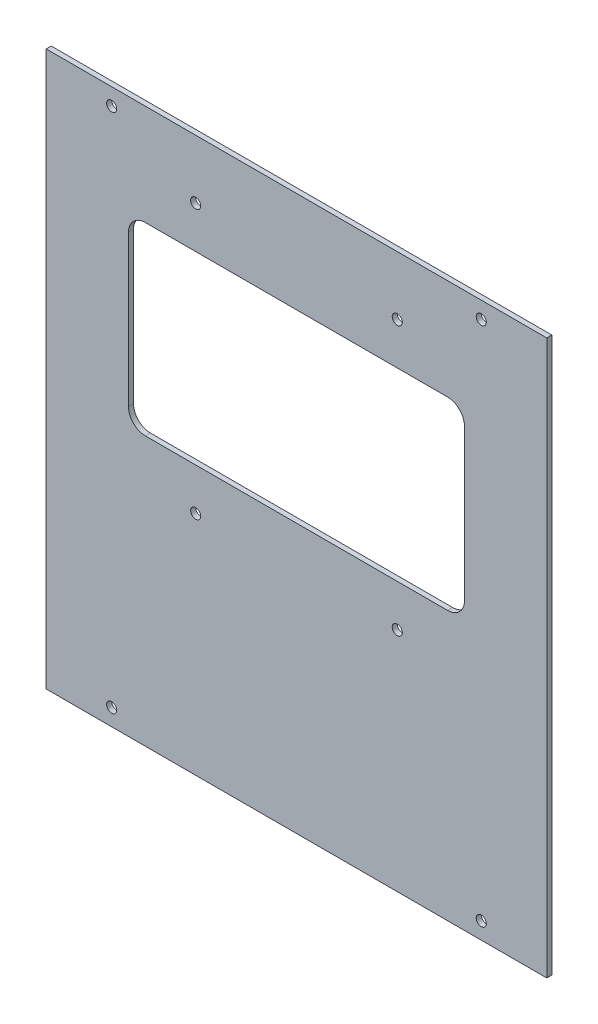
ISO-10303-21;
HEADER;
FILE_DESCRIPTION(('STEP AP214'),'2;1');
FILE_NAME('part.step','',(''),(''),'','','');
FILE_SCHEMA(('AUTOMOTIVE_DESIGN { 1 0 10303 214 1 1 1 1 }'));
ENDSEC;
DATA;
#1=APPLICATION_CONTEXT('core data for automotive mechanical design processes');
#2=APPLICATION_PROTOCOL_DEFINITION('international standard','automotive_design',2000,#1);
#3=PRODUCT_CONTEXT('',#1,'mechanical');
#4=PRODUCT('Part','Part','',(#3));
#5=PRODUCT_RELATED_PRODUCT_CATEGORY('part','',(#4));
#6=PRODUCT_DEFINITION_FORMATION('','',#4);
#7=PRODUCT_DEFINITION_CONTEXT('part definition',#1,'design');
#8=PRODUCT_DEFINITION('design','',#6,#7);
#9=PRODUCT_DEFINITION_SHAPE('','',#8);
#10=(LENGTH_UNIT() NAMED_UNIT(*) SI_UNIT(.MILLI.,.METRE.));
#11=(NAMED_UNIT(*) PLANE_ANGLE_UNIT() SI_UNIT($,.RADIAN.));
#12=(NAMED_UNIT(*) SI_UNIT($,.STERADIAN.) SOLID_ANGLE_UNIT());
#13=UNCERTAINTY_MEASURE_WITH_UNIT(LENGTH_MEASURE(1.E-05),#10,'distance_accuracy_value','');
#14=(GEOMETRIC_REPRESENTATION_CONTEXT(3) GLOBAL_UNCERTAINTY_ASSIGNED_CONTEXT((#13)) GLOBAL_UNIT_ASSIGNED_CONTEXT((#10,
#11,#12)) REPRESENTATION_CONTEXT('',''));
#15=CARTESIAN_POINT('',(0.,0.,0.));
#16=DIRECTION('',(0.,0.,1.));
#17=DIRECTION('',(1.,0.,0.));
#18=AXIS2_PLACEMENT_3D('',#15,#16,#17);
#19=CARTESIAN_POINT('',(0.,0.,1.5));
#20=DIRECTION('',(0.,0.,1.));
#21=DIRECTION('',(1.,0.,0.));
#22=AXIS2_PLACEMENT_3D('',#19,#20,#21);
#23=PLANE('',#22);
#24=CARTESIAN_POINT('',(55.,160.,1.5));
#25=DIRECTION('',(0.,0.,1.));
#26=DIRECTION('',(-1.,0.,0.));
#27=AXIS2_PLACEMENT_3D('',#24,#25,#26);
#28=CIRCLE('',#27,1.5);
#29=CARTESIAN_POINT('',(53.5,160.,1.5));
#30=VERTEX_POINT('',#29);
#31=EDGE_CURVE('E310',#30,#30,#28,.T.);
#32=ORIENTED_EDGE('',*,*,#31,.F.);
#33=EDGE_LOOP('',(#32));
#34=FACE_BOUND('',#33,.T.);
#35=CARTESIAN_POINT('',(55.,4.99999999999999,1.5));
#36=DIRECTION('',(0.,0.,1.));
#37=DIRECTION('',(1.,0.,0.));
#38=AXIS2_PLACEMENT_3D('',#35,#36,#37);
#39=CIRCLE('',#38,1.5);
#40=CARTESIAN_POINT('',(56.5,4.99999999999999,1.5));
#41=VERTEX_POINT('',#40);
#42=EDGE_CURVE('E312',#41,#41,#39,.T.);
#43=ORIENTED_EDGE('',*,*,#42,.F.);
#44=EDGE_LOOP('',(#43));
#45=FACE_BOUND('',#44,.T.);
#46=CARTESIAN_POINT('',(-55.,4.99999999999999,1.5));
#47=DIRECTION('',(0.,0.,1.));
#48=DIRECTION('',(-1.,0.,0.));
#49=AXIS2_PLACEMENT_3D('',#46,#47,#48);
#50=CIRCLE('',#49,1.5);
#51=CARTESIAN_POINT('',(-56.5,4.99999999999999,1.5));
#52=VERTEX_POINT('',#51);
#53=EDGE_CURVE('E318',#52,#52,#50,.T.);
#54=ORIENTED_EDGE('',*,*,#53,.F.);
#55=EDGE_LOOP('',(#54));
#56=FACE_BOUND('',#55,.T.);
#57=CARTESIAN_POINT('',(-55.,160.,1.5));
#58=DIRECTION('',(0.,0.,1.));
#59=DIRECTION('',(1.,0.,0.));
#60=AXIS2_PLACEMENT_3D('',#57,#58,#59);
#61=CIRCLE('',#60,1.5);
#62=CARTESIAN_POINT('',(-53.5,160.,1.5));
#63=VERTEX_POINT('',#62);
#64=EDGE_CURVE('E324',#63,#63,#61,.T.);
#65=ORIENTED_EDGE('',*,*,#64,.F.);
#66=EDGE_LOOP('',(#65));
#67=FACE_BOUND('',#66,.T.);
#68=CARTESIAN_POINT('',(30.,147.5,1.5));
#69=DIRECTION('',(0.,0.,1.));
#70=DIRECTION('',(-1.,0.,0.));
#71=AXIS2_PLACEMENT_3D('',#68,#69,#70);
#72=CIRCLE('',#71,1.50000000000001);
#73=CARTESIAN_POINT('',(28.5,147.5,1.5));
#74=VERTEX_POINT('',#73);
#75=EDGE_CURVE('E330',#74,#74,#72,.T.);
#76=ORIENTED_EDGE('',*,*,#75,.F.);
#77=EDGE_LOOP('',(#76));
#78=FACE_BOUND('',#77,.T.);
#79=CARTESIAN_POINT('',(30.,67.5,1.5));
#80=DIRECTION('',(0.,0.,1.));
#81=DIRECTION('',(1.,0.,0.));
#82=AXIS2_PLACEMENT_3D('',#79,#80,#81);
#83=CIRCLE('',#82,1.50000000000001);
#84=CARTESIAN_POINT('',(31.5,67.5,1.5));
#85=VERTEX_POINT('',#84);
#86=EDGE_CURVE('E336',#85,#85,#83,.T.);
#87=ORIENTED_EDGE('',*,*,#86,.F.);
#88=EDGE_LOOP('',(#87));
#89=FACE_BOUND('',#88,.T.);
#90=CARTESIAN_POINT('',(-30.,67.5,1.5));
#91=DIRECTION('',(0.,0.,1.));
#92=DIRECTION('',(-1.,0.,0.));
#93=AXIS2_PLACEMENT_3D('',#90,#91,#92);
#94=CIRCLE('',#93,1.5);
#95=CARTESIAN_POINT('',(-31.5,67.5,1.5));
#96=VERTEX_POINT('',#95);
#97=EDGE_CURVE('E342',#96,#96,#94,.T.);
#98=ORIENTED_EDGE('',*,*,#97,.F.);
#99=EDGE_LOOP('',(#98));
#100=FACE_BOUND('',#99,.T.);
#101=CARTESIAN_POINT('',(-30.,147.5,1.5));
#102=DIRECTION('',(0.,0.,1.));
#103=DIRECTION('',(1.,0.,0.));
#104=AXIS2_PLACEMENT_3D('',#101,#102,#103);
#105=CIRCLE('',#104,1.5);
#106=CARTESIAN_POINT('',(-28.5,147.5,1.5));
#107=VERTEX_POINT('',#106);
#108=EDGE_CURVE('E210',#107,#107,#105,.T.);
#109=ORIENTED_EDGE('',*,*,#108,.F.);
#110=EDGE_LOOP('',(#109));
#111=FACE_BOUND('',#110,.T.);
#112=DIRECTION('',(0.,-1.,0.));
#113=VECTOR('',#112,1.);
#114=CARTESIAN_POINT('',(-74.5,165.,1.5));
#115=LINE('',#114,#113);
#116=CARTESIAN_POINT('',(-74.5,165.,1.5));
#117=VERTEX_POINT('',#116);
#118=CARTESIAN_POINT('',(-74.5,0.,1.5));
#119=VERTEX_POINT('',#118);
#120=EDGE_CURVE('E135',#117,#119,#115,.T.);
#121=ORIENTED_EDGE('',*,*,#120,.T.);
#122=DIRECTION('',(1.,0.,0.));
#123=VECTOR('',#122,1.);
#124=CARTESIAN_POINT('',(-74.5,0.,1.5));
#125=LINE('',#124,#123);
#126=CARTESIAN_POINT('',(74.5,0.,1.5));
#127=VERTEX_POINT('',#126);
#128=EDGE_CURVE('E124',#119,#127,#125,.T.);
#129=ORIENTED_EDGE('',*,*,#128,.T.);
#130=DIRECTION('',(0.,1.,0.));
#131=VECTOR('',#130,1.);
#132=CARTESIAN_POINT('',(74.5,165.,1.5));
#133=LINE('',#132,#131);
#134=CARTESIAN_POINT('',(74.5,165.,1.5));
#135=VERTEX_POINT('',#134);
#136=EDGE_CURVE('E134',#127,#135,#133,.T.);
#137=ORIENTED_EDGE('',*,*,#136,.T.);
#138=DIRECTION('',(-1.,0.,0.));
#139=VECTOR('',#138,1.);
#140=CARTESIAN_POINT('',(-74.5,165.,1.5));
#141=LINE('',#140,#139);
#142=EDGE_CURVE('E139',#135,#117,#141,.T.);
#143=ORIENTED_EDGE('',*,*,#142,.T.);
#144=EDGE_LOOP('',(#121,#129,#137,#143));
#145=FACE_BOUND('',#144,.T.);
#146=DIRECTION('',(1.,0.,0.));
#147=VECTOR('',#146,1.);
#148=CARTESIAN_POINT('',(-50.0000000000001,80.,1.5));
#149=LINE('',#148,#147);
#150=CARTESIAN_POINT('',(-45.0000000000001,80.,1.5));
#151=VERTEX_POINT('',#150);
#152=CARTESIAN_POINT('',(45.,80.,1.5));
#153=VERTEX_POINT('',#152);
#154=EDGE_CURVE('E203',#151,#153,#149,.T.);
#155=ORIENTED_EDGE('',*,*,#154,.F.);
#156=CARTESIAN_POINT('',(-45.0000000000001,85.,1.5));
#157=DIRECTION('',(0.,0.,1.));
#158=DIRECTION('',(1.,0.,0.));
#159=AXIS2_PLACEMENT_3D('',#156,#157,#158);
#160=CIRCLE('',#159,5.);
#161=CARTESIAN_POINT('',(-50.0000000000001,85.,1.5));
#162=VERTEX_POINT('',#161);
#163=EDGE_CURVE('E11',#151,#162,#160,.F.);
#164=ORIENTED_EDGE('',*,*,#163,.T.);
#165=DIRECTION('',(0.,-1.,0.));
#166=VECTOR('',#165,1.);
#167=CARTESIAN_POINT('',(-50.,135.,1.5));
#168=LINE('',#167,#166);
#169=CARTESIAN_POINT('',(-50.,130.,1.5));
#170=VERTEX_POINT('',#169);
#171=EDGE_CURVE('E201',#170,#162,#168,.T.);
#172=ORIENTED_EDGE('',*,*,#171,.F.);
#173=CARTESIAN_POINT('',(-45.,130.,1.5));
#174=DIRECTION('',(0.,0.,1.));
#175=DIRECTION('',(1.,0.,0.));
#176=AXIS2_PLACEMENT_3D('',#173,#174,#175);
#177=CIRCLE('',#176,5.);
#178=CARTESIAN_POINT('',(-45.,135.,1.5));
#179=VERTEX_POINT('',#178);
#180=EDGE_CURVE('E182',#170,#179,#177,.F.);
#181=ORIENTED_EDGE('',*,*,#180,.T.);
#182=DIRECTION('',(-1.,0.,0.));
#183=VECTOR('',#182,1.);
#184=CARTESIAN_POINT('',(-50.,135.,1.5));
#185=LINE('',#184,#183);
#186=CARTESIAN_POINT('',(45.,135.,1.5));
#187=VERTEX_POINT('',#186);
#188=EDGE_CURVE('E215',#187,#179,#185,.T.);
#189=ORIENTED_EDGE('',*,*,#188,.F.);
#190=CARTESIAN_POINT('',(45.,130.,1.5));
#191=DIRECTION('',(0.,0.,1.));
#192=DIRECTION('',(1.,0.,0.));
#193=AXIS2_PLACEMENT_3D('',#190,#191,#192);
#194=CIRCLE('',#193,5.);
#195=CARTESIAN_POINT('',(50.,130.,1.5));
#196=VERTEX_POINT('',#195);
#197=EDGE_CURVE('E178',#187,#196,#194,.F.);
#198=ORIENTED_EDGE('',*,*,#197,.T.);
#199=DIRECTION('',(0.,1.,0.));
#200=VECTOR('',#199,1.);
#201=CARTESIAN_POINT('',(50.,135.,1.5));
#202=LINE('',#201,#200);
#203=CARTESIAN_POINT('',(50.,85.,1.5));
#204=VERTEX_POINT('',#203);
#205=EDGE_CURVE('E206',#204,#196,#202,.T.);
#206=ORIENTED_EDGE('',*,*,#205,.F.);
#207=CARTESIAN_POINT('',(45.,85.,1.5));
#208=DIRECTION('',(0.,0.,1.));
#209=DIRECTION('',(1.,0.,0.));
#210=AXIS2_PLACEMENT_3D('',#207,#208,#209);
#211=CIRCLE('',#210,5.);
#212=EDGE_CURVE('E174',#204,#153,#211,.F.);
#213=ORIENTED_EDGE('',*,*,#212,.T.);
#214=EDGE_LOOP('',(#155,#164,#172,#181,#189,#198,#206,#213));
#215=FACE_BOUND('',#214,.T.);
#216=ADVANCED_FACE('F35',(#34,#45,#56,#67,#78,#89,#100,#111,#145,#215),#23,.T.);
#217=CARTESIAN_POINT('',(0.,0.,0.));
#218=DIRECTION('',(0.,0.,1.));
#219=DIRECTION('',(1.,0.,0.));
#220=AXIS2_PLACEMENT_3D('',#217,#218,#219);
#221=PLANE('',#220);
#222=CARTESIAN_POINT('',(55.,160.,0.));
#223=DIRECTION('',(0.,0.,1.));
#224=DIRECTION('',(-1.,0.,0.));
#225=AXIS2_PLACEMENT_3D('',#222,#223,#224);
#226=CIRCLE('',#225,1.5);
#227=CARTESIAN_POINT('',(53.5,160.,0.));
#228=VERTEX_POINT('',#227);
#229=EDGE_CURVE('E308',#228,#228,#226,.T.);
#230=ORIENTED_EDGE('',*,*,#229,.T.);
#231=EDGE_LOOP('',(#230));
#232=FACE_BOUND('',#231,.T.);
#233=CARTESIAN_POINT('',(55.,4.99999999999999,0.));
#234=DIRECTION('',(0.,0.,1.));
#235=DIRECTION('',(1.,0.,0.));
#236=AXIS2_PLACEMENT_3D('',#233,#234,#235);
#237=CIRCLE('',#236,1.5);
#238=CARTESIAN_POINT('',(56.5,4.99999999999999,0.));
#239=VERTEX_POINT('',#238);
#240=EDGE_CURVE('E315',#239,#239,#237,.T.);
#241=ORIENTED_EDGE('',*,*,#240,.T.);
#242=EDGE_LOOP('',(#241));
#243=FACE_BOUND('',#242,.T.);
#244=CARTESIAN_POINT('',(-55.,4.99999999999999,0.));
#245=DIRECTION('',(0.,0.,1.));
#246=DIRECTION('',(-1.,0.,0.));
#247=AXIS2_PLACEMENT_3D('',#244,#245,#246);
#248=CIRCLE('',#247,1.5);
#249=CARTESIAN_POINT('',(-56.5,4.99999999999999,0.));
#250=VERTEX_POINT('',#249);
#251=EDGE_CURVE('E321',#250,#250,#248,.T.);
#252=ORIENTED_EDGE('',*,*,#251,.T.);
#253=EDGE_LOOP('',(#252));
#254=FACE_BOUND('',#253,.T.);
#255=CARTESIAN_POINT('',(-55.,160.,0.));
#256=DIRECTION('',(0.,0.,1.));
#257=DIRECTION('',(1.,0.,0.));
#258=AXIS2_PLACEMENT_3D('',#255,#256,#257);
#259=CIRCLE('',#258,1.5);
#260=CARTESIAN_POINT('',(-53.5,160.,0.));
#261=VERTEX_POINT('',#260);
#262=EDGE_CURVE('E327',#261,#261,#259,.T.);
#263=ORIENTED_EDGE('',*,*,#262,.T.);
#264=EDGE_LOOP('',(#263));
#265=FACE_BOUND('',#264,.T.);
#266=CARTESIAN_POINT('',(30.,147.5,0.));
#267=DIRECTION('',(0.,0.,1.));
#268=DIRECTION('',(-1.,0.,0.));
#269=AXIS2_PLACEMENT_3D('',#266,#267,#268);
#270=CIRCLE('',#269,1.50000000000001);
#271=CARTESIAN_POINT('',(28.5,147.5,0.));
#272=VERTEX_POINT('',#271);
#273=EDGE_CURVE('E333',#272,#272,#270,.T.);
#274=ORIENTED_EDGE('',*,*,#273,.T.);
#275=EDGE_LOOP('',(#274));
#276=FACE_BOUND('',#275,.T.);
#277=CARTESIAN_POINT('',(30.,67.5,0.));
#278=DIRECTION('',(0.,0.,1.));
#279=DIRECTION('',(1.,0.,0.));
#280=AXIS2_PLACEMENT_3D('',#277,#278,#279);
#281=CIRCLE('',#280,1.50000000000001);
#282=CARTESIAN_POINT('',(31.5,67.5,0.));
#283=VERTEX_POINT('',#282);
#284=EDGE_CURVE('E339',#283,#283,#281,.T.);
#285=ORIENTED_EDGE('',*,*,#284,.T.);
#286=EDGE_LOOP('',(#285));
#287=FACE_BOUND('',#286,.T.);
#288=CARTESIAN_POINT('',(-30.,67.5,0.));
#289=DIRECTION('',(0.,0.,1.));
#290=DIRECTION('',(-1.,0.,0.));
#291=AXIS2_PLACEMENT_3D('',#288,#289,#290);
#292=CIRCLE('',#291,1.5);
#293=CARTESIAN_POINT('',(-31.5,67.5,0.));
#294=VERTEX_POINT('',#293);
#295=EDGE_CURVE('E345',#294,#294,#292,.T.);
#296=ORIENTED_EDGE('',*,*,#295,.T.);
#297=EDGE_LOOP('',(#296));
#298=FACE_BOUND('',#297,.T.);
#299=CARTESIAN_POINT('',(-30.,147.5,0.));
#300=DIRECTION('',(0.,0.,1.));
#301=DIRECTION('',(1.,0.,0.));
#302=AXIS2_PLACEMENT_3D('',#299,#300,#301);
#303=CIRCLE('',#302,1.5);
#304=CARTESIAN_POINT('',(-28.5,147.5,0.));
#305=VERTEX_POINT('',#304);
#306=EDGE_CURVE('E218',#305,#305,#303,.T.);
#307=ORIENTED_EDGE('',*,*,#306,.T.);
#308=EDGE_LOOP('',(#307));
#309=FACE_BOUND('',#308,.T.);
#310=DIRECTION('',(0.,-1.,0.));
#311=VECTOR('',#310,1.);
#312=CARTESIAN_POINT('',(-74.5,165.,0.));
#313=LINE('',#312,#311);
#314=CARTESIAN_POINT('',(-74.5,165.,0.));
#315=VERTEX_POINT('',#314);
#316=CARTESIAN_POINT('',(-74.5,0.,0.));
#317=VERTEX_POINT('',#316);
#318=EDGE_CURVE('E147',#315,#317,#313,.T.);
#319=ORIENTED_EDGE('',*,*,#318,.F.);
#320=DIRECTION('',(-1.,0.,0.));
#321=VECTOR('',#320,1.);
#322=CARTESIAN_POINT('',(-74.5,165.,0.));
#323=LINE('',#322,#321);
#324=CARTESIAN_POINT('',(74.5,165.,0.));
#325=VERTEX_POINT('',#324);
#326=EDGE_CURVE('E143',#325,#315,#323,.T.);
#327=ORIENTED_EDGE('',*,*,#326,.F.);
#328=DIRECTION('',(0.,1.,0.));
#329=VECTOR('',#328,1.);
#330=CARTESIAN_POINT('',(74.5,165.,0.));
#331=LINE('',#330,#329);
#332=CARTESIAN_POINT('',(74.5,0.,0.));
#333=VERTEX_POINT('',#332);
#334=EDGE_CURVE('E228',#333,#325,#331,.T.);
#335=ORIENTED_EDGE('',*,*,#334,.F.);
#336=DIRECTION('',(1.,0.,0.));
#337=VECTOR('',#336,1.);
#338=CARTESIAN_POINT('',(-74.5,0.,0.));
#339=LINE('',#338,#337);
#340=EDGE_CURVE('E226',#317,#333,#339,.T.);
#341=ORIENTED_EDGE('',*,*,#340,.F.);
#342=EDGE_LOOP('',(#319,#327,#335,#341));
#343=FACE_BOUND('',#342,.T.);
#344=DIRECTION('',(-1.,0.,0.));
#345=VECTOR('',#344,1.);
#346=CARTESIAN_POINT('',(-50.,135.,0.));
#347=LINE('',#346,#345);
#348=CARTESIAN_POINT('',(45.,135.,0.));
#349=VERTEX_POINT('',#348);
#350=CARTESIAN_POINT('',(-45.,135.,0.));
#351=VERTEX_POINT('',#350);
#352=EDGE_CURVE('E204',#349,#351,#347,.T.);
#353=ORIENTED_EDGE('',*,*,#352,.T.);
#354=CARTESIAN_POINT('',(-45.,130.,0.));
#355=DIRECTION('',(0.,0.,1.));
#356=DIRECTION('',(1.,0.,0.));
#357=AXIS2_PLACEMENT_3D('',#354,#355,#356);
#358=CIRCLE('',#357,5.);
#359=CARTESIAN_POINT('',(-50.,130.,0.));
#360=VERTEX_POINT('',#359);
#361=EDGE_CURVE('E180',#351,#360,#358,.T.);
#362=ORIENTED_EDGE('',*,*,#361,.T.);
#363=DIRECTION('',(0.,-1.,0.));
#364=VECTOR('',#363,1.);
#365=CARTESIAN_POINT('',(-50.,135.,0.));
#366=LINE('',#365,#364);
#367=CARTESIAN_POINT('',(-50.0000000000001,85.,0.));
#368=VERTEX_POINT('',#367);
#369=EDGE_CURVE('E190',#360,#368,#366,.T.);
#370=ORIENTED_EDGE('',*,*,#369,.T.);
#371=CARTESIAN_POINT('',(-45.0000000000001,85.,0.));
#372=DIRECTION('',(0.,0.,1.));
#373=DIRECTION('',(1.,0.,0.));
#374=AXIS2_PLACEMENT_3D('',#371,#372,#373);
#375=CIRCLE('',#374,5.);
#376=CARTESIAN_POINT('',(-45.0000000000001,80.,0.));
#377=VERTEX_POINT('',#376);
#378=EDGE_CURVE('E43',#368,#377,#375,.T.);
#379=ORIENTED_EDGE('',*,*,#378,.T.);
#380=DIRECTION('',(1.,0.,0.));
#381=VECTOR('',#380,1.);
#382=CARTESIAN_POINT('',(-50.0000000000001,80.,0.));
#383=LINE('',#382,#381);
#384=CARTESIAN_POINT('',(45.,80.,0.));
#385=VERTEX_POINT('',#384);
#386=EDGE_CURVE('E189',#377,#385,#383,.T.);
#387=ORIENTED_EDGE('',*,*,#386,.T.);
#388=CARTESIAN_POINT('',(45.,85.,0.));
#389=DIRECTION('',(0.,0.,1.));
#390=DIRECTION('',(1.,0.,0.));
#391=AXIS2_PLACEMENT_3D('',#388,#389,#390);
#392=CIRCLE('',#391,5.);
#393=CARTESIAN_POINT('',(50.,85.,0.));
#394=VERTEX_POINT('',#393);
#395=EDGE_CURVE('E172',#385,#394,#392,.T.);
#396=ORIENTED_EDGE('',*,*,#395,.T.);
#397=DIRECTION('',(0.,1.,0.));
#398=VECTOR('',#397,1.);
#399=CARTESIAN_POINT('',(50.,135.,0.));
#400=LINE('',#399,#398);
#401=CARTESIAN_POINT('',(50.,130.,0.));
#402=VERTEX_POINT('',#401);
#403=EDGE_CURVE('E198',#394,#402,#400,.T.);
#404=ORIENTED_EDGE('',*,*,#403,.T.);
#405=CARTESIAN_POINT('',(45.,130.,0.));
#406=DIRECTION('',(0.,0.,1.));
#407=DIRECTION('',(1.,0.,0.));
#408=AXIS2_PLACEMENT_3D('',#405,#406,#407);
#409=CIRCLE('',#408,5.);
#410=EDGE_CURVE('E176',#402,#349,#409,.T.);
#411=ORIENTED_EDGE('',*,*,#410,.T.);
#412=EDGE_LOOP('',(#353,#362,#370,#379,#387,#396,#404,#411));
#413=FACE_BOUND('',#412,.T.);
#414=ADVANCED_FACE('F188',(#232,#243,#254,#265,#276,#287,#298,#309,#343,#413),#221,.F.);
#415=CARTESIAN_POINT('',(-74.5,165.,1.5));
#416=DIRECTION('',(1.,0.,0.));
#417=DIRECTION('',(0.,1.,0.));
#418=AXIS2_PLACEMENT_3D('',#415,#416,#417);
#419=PLANE('',#418);
#420=ORIENTED_EDGE('',*,*,#318,.T.);
#421=DIRECTION('',(0.,0.,-1.));
#422=VECTOR('',#421,1.);
#423=CARTESIAN_POINT('',(-74.5,0.,1.5));
#424=LINE('',#423,#422);
#425=EDGE_CURVE('E128',#119,#317,#424,.T.);
#426=ORIENTED_EDGE('',*,*,#425,.F.);
#427=ORIENTED_EDGE('',*,*,#120,.F.);
#428=DIRECTION('',(0.,0.,-1.));
#429=VECTOR('',#428,1.);
#430=CARTESIAN_POINT('',(-74.5,165.,1.5));
#431=LINE('',#430,#429);
#432=EDGE_CURVE('E224',#117,#315,#431,.T.);
#433=ORIENTED_EDGE('',*,*,#432,.T.);
#434=EDGE_LOOP('',(#420,#426,#427,#433));
#435=FACE_BOUND('',#434,.T.);
#436=ADVANCED_FACE('F145',(#435),#419,.F.);
#437=CARTESIAN_POINT('',(-74.5,0.,1.5));
#438=DIRECTION('',(0.,1.,0.));
#439=DIRECTION('',(0.,0.,1.));
#440=AXIS2_PLACEMENT_3D('',#437,#438,#439);
#441=PLANE('',#440);
#442=ORIENTED_EDGE('',*,*,#340,.T.);
#443=DIRECTION('',(0.,0.,-1.));
#444=VECTOR('',#443,1.);
#445=CARTESIAN_POINT('',(74.5,0.,1.5));
#446=LINE('',#445,#444);
#447=EDGE_CURVE('E131',#127,#333,#446,.T.);
#448=ORIENTED_EDGE('',*,*,#447,.F.);
#449=ORIENTED_EDGE('',*,*,#128,.F.);
#450=ORIENTED_EDGE('',*,*,#425,.T.);
#451=EDGE_LOOP('',(#442,#448,#449,#450));
#452=FACE_BOUND('',#451,.T.);
#453=ADVANCED_FACE('F126',(#452),#441,.F.);
#454=CARTESIAN_POINT('',(74.5,165.,1.5));
#455=DIRECTION('',(-1.,0.,0.));
#456=DIRECTION('',(0.,-1.,0.));
#457=AXIS2_PLACEMENT_3D('',#454,#455,#456);
#458=PLANE('',#457);
#459=ORIENTED_EDGE('',*,*,#334,.T.);
#460=DIRECTION('',(0.,0.,-1.));
#461=VECTOR('',#460,1.);
#462=CARTESIAN_POINT('',(74.5,165.,1.5));
#463=LINE('',#462,#461);
#464=EDGE_CURVE('E152',#135,#325,#463,.T.);
#465=ORIENTED_EDGE('',*,*,#464,.F.);
#466=ORIENTED_EDGE('',*,*,#136,.F.);
#467=ORIENTED_EDGE('',*,*,#447,.T.);
#468=EDGE_LOOP('',(#459,#465,#466,#467));
#469=FACE_BOUND('',#468,.T.);
#470=ADVANCED_FACE('F239',(#469),#458,.F.);
#471=CARTESIAN_POINT('',(-74.5,165.,1.5));
#472=DIRECTION('',(0.,-1.,0.));
#473=DIRECTION('',(0.,0.,-1.));
#474=AXIS2_PLACEMENT_3D('',#471,#472,#473);
#475=PLANE('',#474);
#476=ORIENTED_EDGE('',*,*,#326,.T.);
#477=ORIENTED_EDGE('',*,*,#432,.F.);
#478=ORIENTED_EDGE('',*,*,#142,.F.);
#479=ORIENTED_EDGE('',*,*,#464,.T.);
#480=EDGE_LOOP('',(#476,#477,#478,#479));
#481=FACE_BOUND('',#480,.T.);
#482=ADVANCED_FACE('F235',(#481),#475,.F.);
#483=CARTESIAN_POINT('',(-50.,135.,1.5));
#484=DIRECTION('',(1.,0.,0.));
#485=DIRECTION('',(0.,1.,0.));
#486=AXIS2_PLACEMENT_3D('',#483,#484,#485);
#487=PLANE('',#486);
#488=ORIENTED_EDGE('',*,*,#369,.F.);
#489=DIRECTION('',(0.,0.,-1.));
#490=VECTOR('',#489,1.);
#491=CARTESIAN_POINT('',(-50.,130.,1.5));
#492=LINE('',#491,#490);
#493=EDGE_CURVE('E55',#360,#170,#492,.F.);
#494=ORIENTED_EDGE('',*,*,#493,.T.);
#495=ORIENTED_EDGE('',*,*,#171,.T.);
#496=DIRECTION('',(0.,0.,-1.));
#497=VECTOR('',#496,1.);
#498=CARTESIAN_POINT('',(-50.0000000000001,85.,0.));
#499=LINE('',#498,#497);
#500=EDGE_CURVE('E168',#162,#368,#499,.T.);
#501=ORIENTED_EDGE('',*,*,#500,.T.);
#502=EDGE_LOOP('',(#488,#494,#495,#501));
#503=FACE_BOUND('',#502,.T.);
#504=ADVANCED_FACE('F200',(#503),#487,.T.);
#505=CARTESIAN_POINT('',(-50.0000000000001,80.,1.5));
#506=DIRECTION('',(0.,1.,0.));
#507=DIRECTION('',(-1.,0.,0.));
#508=AXIS2_PLACEMENT_3D('',#505,#506,#507);
#509=PLANE('',#508);
#510=ORIENTED_EDGE('',*,*,#154,.T.);
#511=DIRECTION('',(0.,0.,-1.));
#512=VECTOR('',#511,1.);
#513=CARTESIAN_POINT('',(45.,80.,0.));
#514=LINE('',#513,#512);
#515=EDGE_CURVE('E150',#153,#385,#514,.T.);
#516=ORIENTED_EDGE('',*,*,#515,.T.);
#517=ORIENTED_EDGE('',*,*,#386,.F.);
#518=DIRECTION('',(0.,0.,-1.));
#519=VECTOR('',#518,1.);
#520=CARTESIAN_POINT('',(-45.0000000000001,80.,1.5));
#521=LINE('',#520,#519);
#522=EDGE_CURVE('E148',#377,#151,#521,.F.);
#523=ORIENTED_EDGE('',*,*,#522,.T.);
#524=EDGE_LOOP('',(#510,#516,#517,#523));
#525=FACE_BOUND('',#524,.T.);
#526=ADVANCED_FACE('F196',(#525),#509,.T.);
#527=CARTESIAN_POINT('',(50.,135.,1.5));
#528=DIRECTION('',(-1.,0.,0.));
#529=DIRECTION('',(0.,-1.,0.));
#530=AXIS2_PLACEMENT_3D('',#527,#528,#529);
#531=PLANE('',#530);
#532=ORIENTED_EDGE('',*,*,#403,.F.);
#533=DIRECTION('',(0.,0.,-1.));
#534=VECTOR('',#533,1.);
#535=CARTESIAN_POINT('',(50.,85.,1.5));
#536=LINE('',#535,#534);
#537=EDGE_CURVE('E161',#394,#204,#536,.F.);
#538=ORIENTED_EDGE('',*,*,#537,.T.);
#539=ORIENTED_EDGE('',*,*,#205,.T.);
#540=DIRECTION('',(0.,0.,-1.));
#541=VECTOR('',#540,1.);
#542=CARTESIAN_POINT('',(50.,130.,0.));
#543=LINE('',#542,#541);
#544=EDGE_CURVE('E158',#196,#402,#543,.T.);
#545=ORIENTED_EDGE('',*,*,#544,.T.);
#546=EDGE_LOOP('',(#532,#538,#539,#545));
#547=FACE_BOUND('',#546,.T.);
#548=ADVANCED_FACE('F263',(#547),#531,.T.);
#549=CARTESIAN_POINT('',(-50.,135.,1.5));
#550=DIRECTION('',(0.,-1.,0.));
#551=DIRECTION('',(1.,0.,0.));
#552=AXIS2_PLACEMENT_3D('',#549,#550,#551);
#553=PLANE('',#552);
#554=ORIENTED_EDGE('',*,*,#352,.F.);
#555=DIRECTION('',(0.,0.,-1.));
#556=VECTOR('',#555,1.);
#557=CARTESIAN_POINT('',(45.,135.,1.5));
#558=LINE('',#557,#556);
#559=EDGE_CURVE('E166',#349,#187,#558,.F.);
#560=ORIENTED_EDGE('',*,*,#559,.T.);
#561=ORIENTED_EDGE('',*,*,#188,.T.);
#562=DIRECTION('',(0.,0.,-1.));
#563=VECTOR('',#562,1.);
#564=CARTESIAN_POINT('',(-45.,135.,0.));
#565=LINE('',#564,#563);
#566=EDGE_CURVE('E163',#179,#351,#565,.T.);
#567=ORIENTED_EDGE('',*,*,#566,.T.);
#568=EDGE_LOOP('',(#554,#560,#561,#567));
#569=FACE_BOUND('',#568,.T.);
#570=ADVANCED_FACE('F266',(#569),#553,.T.);
#571=CARTESIAN_POINT('',(45.,85.,1.5));
#572=DIRECTION('',(0.,0.,1.));
#573=DIRECTION('',(1.,0.,0.));
#574=AXIS2_PLACEMENT_3D('',#571,#572,#573);
#575=CYLINDRICAL_SURFACE('',#574,5.);
#576=ORIENTED_EDGE('',*,*,#212,.F.);
#577=ORIENTED_EDGE('',*,*,#537,.F.);
#578=ORIENTED_EDGE('',*,*,#395,.F.);
#579=ORIENTED_EDGE('',*,*,#515,.F.);
#580=EDGE_LOOP('',(#576,#577,#578,#579));
#581=FACE_BOUND('',#580,.T.);
#582=ADVANCED_FACE('F270',(#581),#575,.F.);
#583=CARTESIAN_POINT('',(45.,130.,1.5));
#584=DIRECTION('',(0.,0.,1.));
#585=DIRECTION('',(1.,0.,0.));
#586=AXIS2_PLACEMENT_3D('',#583,#584,#585);
#587=CYLINDRICAL_SURFACE('',#586,5.);
#588=ORIENTED_EDGE('',*,*,#197,.F.);
#589=ORIENTED_EDGE('',*,*,#559,.F.);
#590=ORIENTED_EDGE('',*,*,#410,.F.);
#591=ORIENTED_EDGE('',*,*,#544,.F.);
#592=EDGE_LOOP('',(#588,#589,#590,#591));
#593=FACE_BOUND('',#592,.T.);
#594=ADVANCED_FACE('F426',(#593),#587,.F.);
#595=CARTESIAN_POINT('',(-45.,130.,1.5));
#596=DIRECTION('',(0.,0.,1.));
#597=DIRECTION('',(1.,0.,0.));
#598=AXIS2_PLACEMENT_3D('',#595,#596,#597);
#599=CYLINDRICAL_SURFACE('',#598,5.);
#600=ORIENTED_EDGE('',*,*,#180,.F.);
#601=ORIENTED_EDGE('',*,*,#493,.F.);
#602=ORIENTED_EDGE('',*,*,#361,.F.);
#603=ORIENTED_EDGE('',*,*,#566,.F.);
#604=EDGE_LOOP('',(#600,#601,#602,#603));
#605=FACE_BOUND('',#604,.T.);
#606=ADVANCED_FACE('F420',(#605),#599,.F.);
#607=CARTESIAN_POINT('',(-45.0000000000001,85.,1.5));
#608=DIRECTION('',(0.,0.,1.));
#609=DIRECTION('',(1.,0.,0.));
#610=AXIS2_PLACEMENT_3D('',#607,#608,#609);
#611=CYLINDRICAL_SURFACE('',#610,5.);
#612=ORIENTED_EDGE('',*,*,#163,.F.);
#613=ORIENTED_EDGE('',*,*,#522,.F.);
#614=ORIENTED_EDGE('',*,*,#378,.F.);
#615=ORIENTED_EDGE('',*,*,#500,.F.);
#616=EDGE_LOOP('',(#612,#613,#614,#615));
#617=FACE_BOUND('',#616,.T.);
#618=ADVANCED_FACE('F37',(#617),#611,.F.);
#619=CARTESIAN_POINT('',(-30.,147.5,0.));
#620=DIRECTION('',(0.,0.,1.));
#621=DIRECTION('',(1.,0.,0.));
#622=AXIS2_PLACEMENT_3D('',#619,#620,#621);
#623=CYLINDRICAL_SURFACE('',#622,1.5);
#624=ORIENTED_EDGE('',*,*,#306,.F.);
#625=EDGE_LOOP('',(#624));
#626=FACE_BOUND('',#625,.T.);
#627=ORIENTED_EDGE('',*,*,#108,.T.);
#628=EDGE_LOOP('',(#627));
#629=FACE_BOUND('',#628,.T.);
#630=ADVANCED_FACE('F272',(#626,#629),#623,.F.);
#631=CARTESIAN_POINT('',(-30.,67.5,0.));
#632=DIRECTION('',(0.,0.,1.));
#633=DIRECTION('',(1.,0.,0.));
#634=AXIS2_PLACEMENT_3D('',#631,#632,#633);
#635=CYLINDRICAL_SURFACE('',#634,1.5);
#636=ORIENTED_EDGE('',*,*,#295,.F.);
#637=EDGE_LOOP('',(#636));
#638=FACE_BOUND('',#637,.T.);
#639=ORIENTED_EDGE('',*,*,#97,.T.);
#640=EDGE_LOOP('',(#639));
#641=FACE_BOUND('',#640,.T.);
#642=ADVANCED_FACE('F275',(#638,#641),#635,.F.);
#643=CARTESIAN_POINT('',(30.,67.5,0.));
#644=DIRECTION('',(0.,0.,1.));
#645=DIRECTION('',(1.,0.,0.));
#646=AXIS2_PLACEMENT_3D('',#643,#644,#645);
#647=CYLINDRICAL_SURFACE('',#646,1.50000000000001);
#648=ORIENTED_EDGE('',*,*,#284,.F.);
#649=EDGE_LOOP('',(#648));
#650=FACE_BOUND('',#649,.T.);
#651=ORIENTED_EDGE('',*,*,#86,.T.);
#652=EDGE_LOOP('',(#651));
#653=FACE_BOUND('',#652,.T.);
#654=ADVANCED_FACE('F279',(#650,#653),#647,.F.);
#655=CARTESIAN_POINT('',(30.,147.5,0.));
#656=DIRECTION('',(0.,0.,1.));
#657=DIRECTION('',(1.,0.,0.));
#658=AXIS2_PLACEMENT_3D('',#655,#656,#657);
#659=CYLINDRICAL_SURFACE('',#658,1.50000000000001);
#660=ORIENTED_EDGE('',*,*,#273,.F.);
#661=EDGE_LOOP('',(#660));
#662=FACE_BOUND('',#661,.T.);
#663=ORIENTED_EDGE('',*,*,#75,.T.);
#664=EDGE_LOOP('',(#663));
#665=FACE_BOUND('',#664,.T.);
#666=ADVANCED_FACE('F283',(#662,#665),#659,.F.);
#667=CARTESIAN_POINT('',(-55.,160.,0.));
#668=DIRECTION('',(0.,0.,1.));
#669=DIRECTION('',(1.,0.,0.));
#670=AXIS2_PLACEMENT_3D('',#667,#668,#669);
#671=CYLINDRICAL_SURFACE('',#670,1.5);
#672=ORIENTED_EDGE('',*,*,#262,.F.);
#673=EDGE_LOOP('',(#672));
#674=FACE_BOUND('',#673,.T.);
#675=ORIENTED_EDGE('',*,*,#64,.T.);
#676=EDGE_LOOP('',(#675));
#677=FACE_BOUND('',#676,.T.);
#678=ADVANCED_FACE('F287',(#674,#677),#671,.F.);
#679=CARTESIAN_POINT('',(-55.,4.99999999999999,0.));
#680=DIRECTION('',(0.,0.,1.));
#681=DIRECTION('',(1.,0.,0.));
#682=AXIS2_PLACEMENT_3D('',#679,#680,#681);
#683=CYLINDRICAL_SURFACE('',#682,1.5);
#684=ORIENTED_EDGE('',*,*,#251,.F.);
#685=EDGE_LOOP('',(#684));
#686=FACE_BOUND('',#685,.T.);
#687=ORIENTED_EDGE('',*,*,#53,.T.);
#688=EDGE_LOOP('',(#687));
#689=FACE_BOUND('',#688,.T.);
#690=ADVANCED_FACE('F291',(#686,#689),#683,.F.);
#691=CARTESIAN_POINT('',(55.,4.99999999999999,0.));
#692=DIRECTION('',(0.,0.,1.));
#693=DIRECTION('',(1.,0.,0.));
#694=AXIS2_PLACEMENT_3D('',#691,#692,#693);
#695=CYLINDRICAL_SURFACE('',#694,1.5);
#696=ORIENTED_EDGE('',*,*,#240,.F.);
#697=EDGE_LOOP('',(#696));
#698=FACE_BOUND('',#697,.T.);
#699=ORIENTED_EDGE('',*,*,#42,.T.);
#700=EDGE_LOOP('',(#699));
#701=FACE_BOUND('',#700,.T.);
#702=ADVANCED_FACE('F295',(#698,#701),#695,.F.);
#703=CARTESIAN_POINT('',(55.,160.,0.));
#704=DIRECTION('',(0.,0.,1.));
#705=DIRECTION('',(1.,0.,0.));
#706=AXIS2_PLACEMENT_3D('',#703,#704,#705);
#707=CYLINDRICAL_SURFACE('',#706,1.5);
#708=ORIENTED_EDGE('',*,*,#229,.F.);
#709=EDGE_LOOP('',(#708));
#710=FACE_BOUND('',#709,.T.);
#711=ORIENTED_EDGE('',*,*,#31,.T.);
#712=EDGE_LOOP('',(#711));
#713=FACE_BOUND('',#712,.T.);
#714=ADVANCED_FACE('F299',(#710,#713),#707,.F.);
#715=CLOSED_SHELL('',(#216,#414,#436,#453,#470,#482,#504,#526,#548,#570,#582,#594,#606,#618,
#630,#642,#654,#666,#678,#690,#702,#714));
#716=MANIFOLD_SOLID_BREP('B2',#715);
#717=ADVANCED_BREP_SHAPE_REPRESENTATION('',(#18,#716),#14);
#718=SHAPE_DEFINITION_REPRESENTATION(#9,#717);
ENDSEC;
END-ISO-10303-21;
